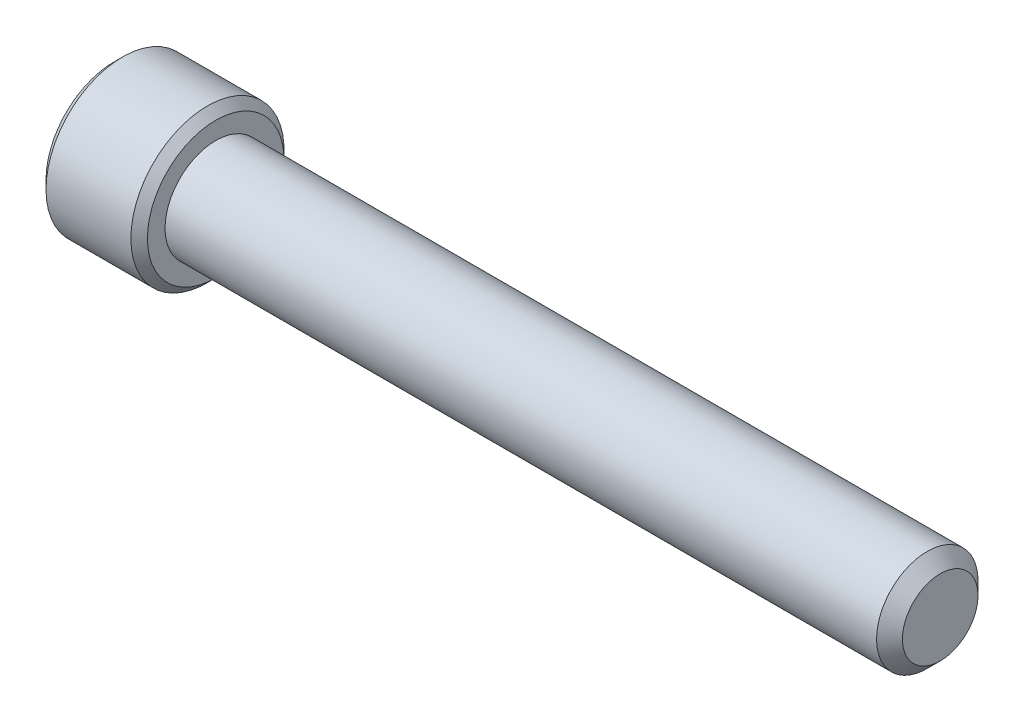
ISO-10303-21;
HEADER;
FILE_DESCRIPTION(('STEP AP214'),'2;1');
FILE_NAME('part.step','',(''),(''),'','','');
FILE_SCHEMA(('AUTOMOTIVE_DESIGN { 1 0 10303 214 1 1 1 1 }'));
ENDSEC;
DATA;
#1=APPLICATION_CONTEXT('core data for automotive mechanical design processes');
#2=APPLICATION_PROTOCOL_DEFINITION('international standard','automotive_design',2000,#1);
#3=PRODUCT_CONTEXT('',#1,'mechanical');
#4=PRODUCT('Part','Part','',(#3));
#5=PRODUCT_RELATED_PRODUCT_CATEGORY('part','',(#4));
#6=PRODUCT_DEFINITION_FORMATION('','',#4);
#7=PRODUCT_DEFINITION_CONTEXT('part definition',#1,'design');
#8=PRODUCT_DEFINITION('design','',#6,#7);
#9=PRODUCT_DEFINITION_SHAPE('','',#8);
#10=(LENGTH_UNIT() NAMED_UNIT(*) SI_UNIT(.MILLI.,.METRE.));
#11=(NAMED_UNIT(*) PLANE_ANGLE_UNIT() SI_UNIT($,.RADIAN.));
#12=(NAMED_UNIT(*) SI_UNIT($,.STERADIAN.) SOLID_ANGLE_UNIT());
#13=UNCERTAINTY_MEASURE_WITH_UNIT(LENGTH_MEASURE(1.E-05),#10,'distance_accuracy_value','');
#14=(GEOMETRIC_REPRESENTATION_CONTEXT(3) GLOBAL_UNCERTAINTY_ASSIGNED_CONTEXT((#13)) GLOBAL_UNIT_ASSIGNED_CONTEXT((#10,
#11,#12)) REPRESENTATION_CONTEXT('',''));
#15=CARTESIAN_POINT('',(0.,0.,0.));
#16=DIRECTION('',(0.,0.,1.));
#17=DIRECTION('',(1.,0.,0.));
#18=AXIS2_PLACEMENT_3D('',#15,#16,#17);
#19=CARTESIAN_POINT('',(25.336499999988,0.,0.));
#20=DIRECTION('',(-1.,0.,0.));
#21=DIRECTION('',(0.,0.,1.));
#22=AXIS2_PLACEMENT_3D('',#19,#20,#21);
#23=PLANE('',#22);
#24=CARTESIAN_POINT('',(25.336499999988,0.,0.));
#25=DIRECTION('',(-1.,0.,0.));
#26=DIRECTION('',(0.,0.,1.));
#27=AXIS2_PLACEMENT_3D('',#24,#25,#26);
#28=CIRCLE('',#27,2.31775000002391);
#29=CARTESIAN_POINT('',(25.336499999988,0.,2.31775000002391));
#30=VERTEX_POINT('',#29);
#31=EDGE_CURVE('E11',#30,#30,#28,.T.);
#32=ORIENTED_EDGE('',*,*,#31,.F.);
#33=EDGE_LOOP('',(#32));
#34=FACE_BOUND('',#33,.T.);
#35=ADVANCED_FACE('F36',(#34),#23,.F.);
#36=CARTESIAN_POINT('',(25.336499999988,0.,0.));
#37=DIRECTION('',(-1.,0.,0.));
#38=DIRECTION('',(0.,0.,1.));
#39=AXIS2_PLACEMENT_3D('',#36,#37,#38);
#40=CONICAL_SURFACE('',#39,2.31775000002391,0.785398163397444);
#41=CARTESIAN_POINT('',(24.5427500000119,0.,0.));
#42=DIRECTION('',(-1.,0.,0.));
#43=DIRECTION('',(0.,0.,1.));
#44=AXIS2_PLACEMENT_3D('',#41,#42,#43);
#45=CIRCLE('',#44,3.11150000000002);
#46=CARTESIAN_POINT('',(24.5427500000119,0.,3.11150000000002));
#47=VERTEX_POINT('',#46);
#48=EDGE_CURVE('E43',#47,#47,#45,.T.);
#49=ORIENTED_EDGE('',*,*,#48,.F.);
#50=EDGE_LOOP('',(#49));
#51=FACE_BOUND('',#50,.T.);
#52=ORIENTED_EDGE('',*,*,#31,.T.);
#53=EDGE_LOOP('',(#52));
#54=FACE_BOUND('',#53,.T.);
#55=ADVANCED_FACE('F161',(#51,#54),#40,.T.);
#56=CARTESIAN_POINT('',(-124.874669814116,0.,0.));
#57=DIRECTION('',(-1.,0.,0.));
#58=DIRECTION('',(0.,0.,1.));
#59=AXIS2_PLACEMENT_3D('',#56,#57,#58);
#60=CYLINDRICAL_SURFACE('',#59,3.11150000000002);
#61=CARTESIAN_POINT('',(-19.113499999988,0.,0.));
#62=DIRECTION('',(-1.,0.,0.));
#63=DIRECTION('',(0.,0.,1.));
#64=AXIS2_PLACEMENT_3D('',#61,#62,#63);
#65=CIRCLE('',#64,3.11150000000001);
#66=CARTESIAN_POINT('',(-19.113499999988,0.,3.11150000000001));
#67=VERTEX_POINT('',#66);
#68=EDGE_CURVE('E154',#67,#67,#65,.T.);
#69=ORIENTED_EDGE('',*,*,#68,.F.);
#70=EDGE_LOOP('',(#69));
#71=FACE_BOUND('',#70,.T.);
#72=ORIENTED_EDGE('',*,*,#48,.T.);
#73=EDGE_LOOP('',(#72));
#74=FACE_BOUND('',#73,.T.);
#75=ADVANCED_FACE('F159',(#71,#74),#60,.T.);
#76=CARTESIAN_POINT('',(-19.113499999988,3.11150000000001,0.));
#77=DIRECTION('',(-1.,0.,0.));
#78=DIRECTION('',(0.,0.,1.));
#79=AXIS2_PLACEMENT_3D('',#76,#77,#78);
#80=PLANE('',#79);
#81=CARTESIAN_POINT('',(-19.113499999988,0.,0.));
#82=DIRECTION('',(-1.,0.,0.));
#83=DIRECTION('',(0.,0.,1.));
#84=AXIS2_PLACEMENT_3D('',#81,#82,#83);
#85=CIRCLE('',#84,4.191);
#86=CARTESIAN_POINT('',(-19.113499999988,0.,4.191));
#87=VERTEX_POINT('',#86);
#88=EDGE_CURVE('E151',#87,#87,#85,.T.);
#89=ORIENTED_EDGE('',*,*,#88,.F.);
#90=EDGE_LOOP('',(#89));
#91=FACE_BOUND('',#90,.T.);
#92=ORIENTED_EDGE('',*,*,#68,.T.);
#93=EDGE_LOOP('',(#92));
#94=FACE_BOUND('',#93,.T.);
#95=ADVANCED_FACE('F179',(#91,#94),#80,.F.);
#96=CARTESIAN_POINT('',(-19.113499999988,0.,0.));
#97=DIRECTION('',(-1.,0.,0.));
#98=DIRECTION('',(0.,0.,1.));
#99=AXIS2_PLACEMENT_3D('',#96,#97,#98);
#100=CONICAL_SURFACE('',#99,4.191,0.785398163397453);
#101=CARTESIAN_POINT('',(-19.621499999988,0.,0.));
#102=DIRECTION('',(-1.,0.,0.));
#103=DIRECTION('',(0.,0.,1.));
#104=AXIS2_PLACEMENT_3D('',#101,#102,#103);
#105=CIRCLE('',#104,4.699);
#106=CARTESIAN_POINT('',(-19.621499999988,0.,4.699));
#107=VERTEX_POINT('',#106);
#108=EDGE_CURVE('E148',#107,#107,#105,.T.);
#109=ORIENTED_EDGE('',*,*,#108,.F.);
#110=EDGE_LOOP('',(#109));
#111=FACE_BOUND('',#110,.T.);
#112=ORIENTED_EDGE('',*,*,#88,.T.);
#113=EDGE_LOOP('',(#112));
#114=FACE_BOUND('',#113,.T.);
#115=ADVANCED_FACE('F187',(#111,#114),#100,.T.);
#116=CARTESIAN_POINT('',(-124.874669814116,0.,0.));
#117=DIRECTION('',(-1.,0.,0.));
#118=DIRECTION('',(0.,0.,1.));
#119=AXIS2_PLACEMENT_3D('',#116,#117,#118);
#120=CYLINDRICAL_SURFACE('',#119,4.699);
#121=CARTESIAN_POINT('',(-24.828499999988,0.,0.));
#122=DIRECTION('',(-1.,0.,0.));
#123=DIRECTION('',(0.,0.,1.));
#124=AXIS2_PLACEMENT_3D('',#121,#122,#123);
#125=CIRCLE('',#124,4.699);
#126=CARTESIAN_POINT('',(-24.828499999988,0.,4.699));
#127=VERTEX_POINT('',#126);
#128=EDGE_CURVE('E145',#127,#127,#125,.T.);
#129=ORIENTED_EDGE('',*,*,#128,.F.);
#130=EDGE_LOOP('',(#129));
#131=FACE_BOUND('',#130,.T.);
#132=ORIENTED_EDGE('',*,*,#108,.T.);
#133=EDGE_LOOP('',(#132));
#134=FACE_BOUND('',#133,.T.);
#135=ADVANCED_FACE('F195',(#131,#134),#120,.T.);
#136=CARTESIAN_POINT('',(-24.828499999988,0.,0.));
#137=DIRECTION('',(1.,0.,0.));
#138=DIRECTION('',(0.,0.,-1.));
#139=AXIS2_PLACEMENT_3D('',#136,#137,#138);
#140=CONICAL_SURFACE('',#139,4.699,0.785398163397452);
#141=CARTESIAN_POINT('',(-25.336499999988,0.,0.));
#142=DIRECTION('',(-1.,0.,0.));
#143=DIRECTION('',(0.,0.,1.));
#144=AXIS2_PLACEMENT_3D('',#141,#142,#143);
#145=CIRCLE('',#144,4.191);
#146=CARTESIAN_POINT('',(-25.336499999988,0.,4.191));
#147=VERTEX_POINT('',#146);
#148=EDGE_CURVE('E137',#147,#147,#145,.T.);
#149=ORIENTED_EDGE('',*,*,#148,.F.);
#150=EDGE_LOOP('',(#149));
#151=FACE_BOUND('',#150,.T.);
#152=ORIENTED_EDGE('',*,*,#128,.T.);
#153=EDGE_LOOP('',(#152));
#154=FACE_BOUND('',#153,.T.);
#155=ADVANCED_FACE('F203',(#151,#154),#140,.T.);
#156=CARTESIAN_POINT('',(-25.336499999988,4.191,0.));
#157=DIRECTION('',(1.,0.,0.));
#158=DIRECTION('',(0.,0.,-1.));
#159=AXIS2_PLACEMENT_3D('',#156,#157,#158);
#160=PLANE('',#159);
#161=DIRECTION('',(0.,-0.5,-0.866025403784439));
#162=VECTOR('',#161,1.);
#163=CARTESIAN_POINT('',(-25.336499999988,2.74963065701561,0.));
#164=LINE('',#163,#162);
#165=CARTESIAN_POINT('',(-25.336499999988,2.74963065701561,0.));
#166=VERTEX_POINT('',#165);
#167=CARTESIAN_POINT('',(-25.336499999988,1.37481532850786,-2.38124999999992));
#168=VERTEX_POINT('',#167);
#169=EDGE_CURVE('E124',#166,#168,#164,.T.);
#170=ORIENTED_EDGE('',*,*,#169,.F.);
#171=DIRECTION('',(0.,0.5,-0.866025403784439));
#172=VECTOR('',#171,1.);
#173=CARTESIAN_POINT('',(-25.336499999988,1.37481532850786,2.38124999999992));
#174=LINE('',#173,#172);
#175=CARTESIAN_POINT('',(-25.336499999988,1.37481532850786,2.38124999999992));
#176=VERTEX_POINT('',#175);
#177=EDGE_CURVE('E50',#176,#166,#174,.T.);
#178=ORIENTED_EDGE('',*,*,#177,.F.);
#179=DIRECTION('',(0.,1.,0.));
#180=VECTOR('',#179,1.);
#181=CARTESIAN_POINT('',(-25.336499999988,-1.37481532850786,2.38124999999992));
#182=LINE('',#181,#180);
#183=CARTESIAN_POINT('',(-25.336499999988,-1.37481532850786,2.38124999999992));
#184=VERTEX_POINT('',#183);
#185=EDGE_CURVE('E133',#184,#176,#182,.T.);
#186=ORIENTED_EDGE('',*,*,#185,.F.);
#187=DIRECTION('',(0.,0.5,0.866025403784439));
#188=VECTOR('',#187,1.);
#189=CARTESIAN_POINT('',(-25.336499999988,-2.74963065701561,0.));
#190=LINE('',#189,#188);
#191=CARTESIAN_POINT('',(-25.336499999988,-2.74963065701561,0.));
#192=VERTEX_POINT('',#191);
#193=EDGE_CURVE('E131',#192,#184,#190,.T.);
#194=ORIENTED_EDGE('',*,*,#193,.F.);
#195=DIRECTION('',(0.,-0.5,0.866025403784439));
#196=VECTOR('',#195,1.);
#197=CARTESIAN_POINT('',(-25.336499999988,-1.37481532850786,-2.38124999999992));
#198=LINE('',#197,#196);
#199=CARTESIAN_POINT('',(-25.336499999988,-1.37481532850786,-2.38124999999992));
#200=VERTEX_POINT('',#199);
#201=EDGE_CURVE('E98',#200,#192,#198,.T.);
#202=ORIENTED_EDGE('',*,*,#201,.F.);
#203=DIRECTION('',(0.,-1.,0.));
#204=VECTOR('',#203,1.);
#205=CARTESIAN_POINT('',(-25.336499999988,1.37481532850786,-2.38124999999992));
#206=LINE('',#205,#204);
#207=EDGE_CURVE('E127',#168,#200,#206,.T.);
#208=ORIENTED_EDGE('',*,*,#207,.F.);
#209=EDGE_LOOP('',(#170,#178,#186,#194,#202,#208));
#210=FACE_BOUND('',#209,.T.);
#211=ORIENTED_EDGE('',*,*,#148,.T.);
#212=EDGE_LOOP('',(#211));
#213=FACE_BOUND('',#212,.T.);
#214=ADVANCED_FACE('F211',(#210,#213),#160,.F.);
#215=CARTESIAN_POINT('',(-21.526499999988,1.37481532850786,2.38124999999992));
#216=DIRECTION('',(0.,0.866025403784439,0.5));
#217=DIRECTION('',(0.,-0.5,0.866025403784439));
#218=AXIS2_PLACEMENT_3D('',#215,#216,#217);
#219=PLANE('',#218);
#220=ORIENTED_EDGE('',*,*,#177,.T.);
#221=DIRECTION('',(-1.,0.,0.));
#222=VECTOR('',#221,1.);
#223=CARTESIAN_POINT('',(-21.526499999988,2.74963065701561,0.));
#224=LINE('',#223,#222);
#225=CARTESIAN_POINT('',(-21.526499999988,2.74963065701561,0.));
#226=VERTEX_POINT('',#225);
#227=EDGE_CURVE('E80',#226,#166,#224,.T.);
#228=ORIENTED_EDGE('',*,*,#227,.F.);
#229=DIRECTION('',(0.,0.5,-0.866025403784439));
#230=VECTOR('',#229,1.);
#231=CARTESIAN_POINT('',(-21.526499999988,1.37481532850786,2.38124999999992));
#232=LINE('',#231,#230);
#233=CARTESIAN_POINT('',(-21.526499999988,1.37481532850786,2.38124999999992));
#234=VERTEX_POINT('',#233);
#235=EDGE_CURVE('E135',#234,#226,#232,.T.);
#236=ORIENTED_EDGE('',*,*,#235,.F.);
#237=DIRECTION('',(-1.,0.,0.));
#238=VECTOR('',#237,1.);
#239=CARTESIAN_POINT('',(-21.526499999988,1.37481532850786,2.38124999999992));
#240=LINE('',#239,#238);
#241=EDGE_CURVE('E58',#234,#176,#240,.T.);
#242=ORIENTED_EDGE('',*,*,#241,.T.);
#243=EDGE_LOOP('',(#220,#228,#236,#242));
#244=FACE_BOUND('',#243,.T.);
#245=ADVANCED_FACE('F219',(#244),#219,.F.);
#246=CARTESIAN_POINT('',(-21.526499999988,-1.37481532850786,2.38124999999992));
#247=DIRECTION('',(0.,0.,1.));
#248=DIRECTION('',(1.,0.,0.));
#249=AXIS2_PLACEMENT_3D('',#246,#247,#248);
#250=PLANE('',#249);
#251=ORIENTED_EDGE('',*,*,#185,.T.);
#252=ORIENTED_EDGE('',*,*,#241,.F.);
#253=DIRECTION('',(0.,1.,0.));
#254=VECTOR('',#253,1.);
#255=CARTESIAN_POINT('',(-21.526499999988,-1.37481532850786,2.38124999999992));
#256=LINE('',#255,#254);
#257=CARTESIAN_POINT('',(-21.526499999988,-1.37481532850786,2.38124999999992));
#258=VERTEX_POINT('',#257);
#259=EDGE_CURVE('E110',#258,#234,#256,.T.);
#260=ORIENTED_EDGE('',*,*,#259,.F.);
#261=DIRECTION('',(-1.,0.,0.));
#262=VECTOR('',#261,1.);
#263=CARTESIAN_POINT('',(-21.526499999988,-1.37481532850786,2.38124999999992));
#264=LINE('',#263,#262);
#265=EDGE_CURVE('E102',#258,#184,#264,.T.);
#266=ORIENTED_EDGE('',*,*,#265,.T.);
#267=EDGE_LOOP('',(#251,#252,#260,#266));
#268=FACE_BOUND('',#267,.T.);
#269=ADVANCED_FACE('F227',(#268),#250,.F.);
#270=CARTESIAN_POINT('',(-21.526499999988,-2.74963065701561,0.));
#271=DIRECTION('',(0.,-0.866025403784439,0.5));
#272=DIRECTION('',(0.,-0.5,-0.866025403784439));
#273=AXIS2_PLACEMENT_3D('',#270,#271,#272);
#274=PLANE('',#273);
#275=ORIENTED_EDGE('',*,*,#193,.T.);
#276=ORIENTED_EDGE('',*,*,#265,.F.);
#277=DIRECTION('',(0.,0.5,0.866025403784439));
#278=VECTOR('',#277,1.);
#279=CARTESIAN_POINT('',(-21.526499999988,-2.74963065701561,0.));
#280=LINE('',#279,#278);
#281=CARTESIAN_POINT('',(-21.526499999988,-2.74963065701561,0.));
#282=VERTEX_POINT('',#281);
#283=EDGE_CURVE('E106',#282,#258,#280,.T.);
#284=ORIENTED_EDGE('',*,*,#283,.F.);
#285=DIRECTION('',(-1.,0.,0.));
#286=VECTOR('',#285,1.);
#287=CARTESIAN_POINT('',(-21.526499999988,-2.74963065701561,0.));
#288=LINE('',#287,#286);
#289=EDGE_CURVE('E91',#282,#192,#288,.T.);
#290=ORIENTED_EDGE('',*,*,#289,.T.);
#291=EDGE_LOOP('',(#275,#276,#284,#290));
#292=FACE_BOUND('',#291,.T.);
#293=ADVANCED_FACE('F107',(#292),#274,.F.);
#294=CARTESIAN_POINT('',(-21.526499999988,-1.37481532850786,-2.38124999999992));
#295=DIRECTION('',(0.,-0.866025403784439,-0.5));
#296=DIRECTION('',(0.,0.5,-0.866025403784439));
#297=AXIS2_PLACEMENT_3D('',#294,#295,#296);
#298=PLANE('',#297);
#299=ORIENTED_EDGE('',*,*,#201,.T.);
#300=ORIENTED_EDGE('',*,*,#289,.F.);
#301=DIRECTION('',(0.,-0.5,0.866025403784439));
#302=VECTOR('',#301,1.);
#303=CARTESIAN_POINT('',(-21.526499999988,-1.37481532850786,-2.38124999999992));
#304=LINE('',#303,#302);
#305=CARTESIAN_POINT('',(-21.526499999988,-1.37481532850786,-2.38124999999992));
#306=VERTEX_POINT('',#305);
#307=EDGE_CURVE('E95',#306,#282,#304,.T.);
#308=ORIENTED_EDGE('',*,*,#307,.F.);
#309=DIRECTION('',(-1.,0.,0.));
#310=VECTOR('',#309,1.);
#311=CARTESIAN_POINT('',(-21.526499999988,-1.37481532850786,-2.38124999999992));
#312=LINE('',#311,#310);
#313=EDGE_CURVE('E103',#306,#200,#312,.T.);
#314=ORIENTED_EDGE('',*,*,#313,.T.);
#315=EDGE_LOOP('',(#299,#300,#308,#314));
#316=FACE_BOUND('',#315,.T.);
#317=ADVANCED_FACE('F93',(#316),#298,.F.);
#318=CARTESIAN_POINT('',(-21.526499999988,1.37481532850786,-2.38124999999992));
#319=DIRECTION('',(0.,0.,-1.));
#320=DIRECTION('',(-1.,0.,0.));
#321=AXIS2_PLACEMENT_3D('',#318,#319,#320);
#322=PLANE('',#321);
#323=ORIENTED_EDGE('',*,*,#207,.T.);
#324=ORIENTED_EDGE('',*,*,#313,.F.);
#325=DIRECTION('',(0.,-1.,0.));
#326=VECTOR('',#325,1.);
#327=CARTESIAN_POINT('',(-21.526499999988,1.37481532850786,-2.38124999999992));
#328=LINE('',#327,#326);
#329=CARTESIAN_POINT('',(-21.526499999988,1.37481532850786,-2.38124999999992));
#330=VERTEX_POINT('',#329);
#331=EDGE_CURVE('E116',#330,#306,#328,.T.);
#332=ORIENTED_EDGE('',*,*,#331,.F.);
#333=DIRECTION('',(-1.,0.,0.));
#334=VECTOR('',#333,1.);
#335=CARTESIAN_POINT('',(-21.526499999988,1.37481532850786,-2.38124999999992));
#336=LINE('',#335,#334);
#337=EDGE_CURVE('E140',#330,#168,#336,.T.);
#338=ORIENTED_EDGE('',*,*,#337,.T.);
#339=EDGE_LOOP('',(#323,#324,#332,#338));
#340=FACE_BOUND('',#339,.T.);
#341=ADVANCED_FACE('F246',(#340),#322,.F.);
#342=CARTESIAN_POINT('',(-21.526499999988,2.74963065701561,0.));
#343=DIRECTION('',(0.,0.866025403784439,-0.5));
#344=DIRECTION('',(0.,0.5,0.866025403784439));
#345=AXIS2_PLACEMENT_3D('',#342,#343,#344);
#346=PLANE('',#345);
#347=ORIENTED_EDGE('',*,*,#169,.T.);
#348=ORIENTED_EDGE('',*,*,#337,.F.);
#349=DIRECTION('',(0.,-0.5,-0.866025403784439));
#350=VECTOR('',#349,1.);
#351=CARTESIAN_POINT('',(-21.526499999988,2.74963065701561,0.));
#352=LINE('',#351,#350);
#353=EDGE_CURVE('E118',#226,#330,#352,.T.);
#354=ORIENTED_EDGE('',*,*,#353,.F.);
#355=ORIENTED_EDGE('',*,*,#227,.T.);
#356=EDGE_LOOP('',(#347,#348,#354,#355));
#357=FACE_BOUND('',#356,.T.);
#358=ADVANCED_FACE('F253',(#357),#346,.F.);
#359=CARTESIAN_POINT('',(-21.526499999988,2.74963065701561,0.));
#360=DIRECTION('',(-1.,0.,0.));
#361=DIRECTION('',(0.,0.,1.));
#362=AXIS2_PLACEMENT_3D('',#359,#360,#361);
#363=PLANE('',#362);
#364=ORIENTED_EDGE('',*,*,#235,.T.);
#365=ORIENTED_EDGE('',*,*,#353,.T.);
#366=ORIENTED_EDGE('',*,*,#331,.T.);
#367=ORIENTED_EDGE('',*,*,#307,.T.);
#368=ORIENTED_EDGE('',*,*,#283,.T.);
#369=ORIENTED_EDGE('',*,*,#259,.T.);
#370=EDGE_LOOP('',(#364,#365,#366,#367,#368,#369));
#371=FACE_BOUND('',#370,.T.);
#372=ADVANCED_FACE('F113',(#371),#363,.T.);
#373=CLOSED_SHELL('',(#35,#55,#75,#95,#115,#135,#155,#214,#245,#269,#293,#317,#341,#358,#372));
#374=MANIFOLD_SOLID_BREP('B2',#373);
#375=ADVANCED_BREP_SHAPE_REPRESENTATION('',(#18,#374),#14);
#376=SHAPE_DEFINITION_REPRESENTATION(#9,#375);
ENDSEC;
END-ISO-10303-21;
